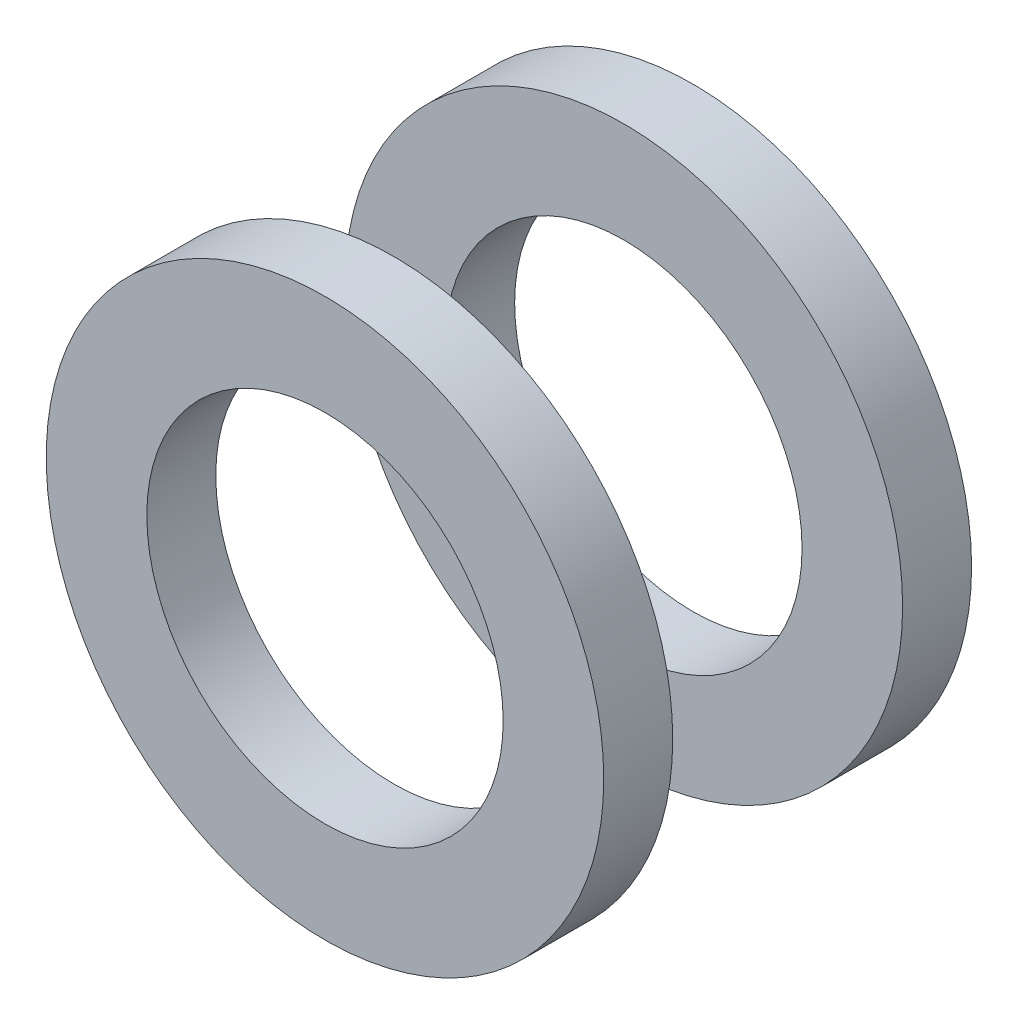
ISO-10303-21;
HEADER;
FILE_DESCRIPTION(('STEP AP214'),'2;1');
FILE_NAME('part.step','',(''),(''),'','','');
FILE_SCHEMA(('AUTOMOTIVE_DESIGN { 1 0 10303 214 1 1 1 1 }'));
ENDSEC;
DATA;
#1=APPLICATION_CONTEXT('core data for automotive mechanical design processes');
#2=APPLICATION_PROTOCOL_DEFINITION('international standard','automotive_design',2000,#1);
#3=PRODUCT_CONTEXT('',#1,'mechanical');
#4=PRODUCT('Part','Part','',(#3));
#5=PRODUCT_RELATED_PRODUCT_CATEGORY('part','',(#4));
#6=PRODUCT_DEFINITION_FORMATION('','',#4);
#7=PRODUCT_DEFINITION_CONTEXT('part definition',#1,'design');
#8=PRODUCT_DEFINITION('design','',#6,#7);
#9=PRODUCT_DEFINITION_SHAPE('','',#8);
#10=(LENGTH_UNIT() NAMED_UNIT(*) SI_UNIT(.MILLI.,.METRE.));
#11=(NAMED_UNIT(*) PLANE_ANGLE_UNIT() SI_UNIT($,.RADIAN.));
#12=(NAMED_UNIT(*) SI_UNIT($,.STERADIAN.) SOLID_ANGLE_UNIT());
#13=UNCERTAINTY_MEASURE_WITH_UNIT(LENGTH_MEASURE(1.E-05),#10,'distance_accuracy_value','');
#14=(GEOMETRIC_REPRESENTATION_CONTEXT(3) GLOBAL_UNCERTAINTY_ASSIGNED_CONTEXT((#13)) GLOBAL_UNIT_ASSIGNED_CONTEXT((#10,
#11,#12)) REPRESENTATION_CONTEXT('',''));
#15=CARTESIAN_POINT('',(0.,0.,0.));
#16=DIRECTION('',(0.,0.,1.));
#17=DIRECTION('',(1.,0.,0.));
#18=AXIS2_PLACEMENT_3D('',#15,#16,#17);
#19=CARTESIAN_POINT('',(0.,0.,32.));
#20=DIRECTION('',(0.,0.,1.));
#21=DIRECTION('',(1.,0.,0.));
#22=AXIS2_PLACEMENT_3D('',#19,#20,#21);
#23=PLANE('',#22);
#24=CARTESIAN_POINT('',(0.,0.,32.));
#25=DIRECTION('',(0.,0.,1.));
#26=DIRECTION('',(1.,0.,0.));
#27=AXIS2_PLACEMENT_3D('',#24,#25,#26);
#28=CIRCLE('',#27,48.5);
#29=CARTESIAN_POINT('',(48.5,0.,32.));
#30=VERTEX_POINT('',#29);
#31=EDGE_CURVE('E11',#30,#30,#28,.T.);
#32=ORIENTED_EDGE('',*,*,#31,.T.);
#33=EDGE_LOOP('',(#32));
#34=FACE_BOUND('',#33,.T.);
#35=CARTESIAN_POINT('',(0.,0.,32.));
#36=DIRECTION('',(0.,0.,1.));
#37=DIRECTION('',(1.,0.,0.));
#38=AXIS2_PLACEMENT_3D('',#35,#36,#37);
#39=CIRCLE('',#38,31.);
#40=CARTESIAN_POINT('',(31.,0.,32.));
#41=VERTEX_POINT('',#40);
#42=EDGE_CURVE('E58',#41,#41,#39,.T.);
#43=ORIENTED_EDGE('',*,*,#42,.F.);
#44=EDGE_LOOP('',(#43));
#45=FACE_BOUND('',#44,.T.);
#46=ADVANCED_FACE('F44',(#34,#45),#23,.T.);
#47=CARTESIAN_POINT('',(0.,0.,20.));
#48=DIRECTION('',(0.,0.,1.));
#49=DIRECTION('',(1.,0.,0.));
#50=AXIS2_PLACEMENT_3D('',#47,#48,#49);
#51=PLANE('',#50);
#52=CARTESIAN_POINT('',(0.,0.,20.));
#53=DIRECTION('',(0.,0.,1.));
#54=DIRECTION('',(1.,0.,0.));
#55=AXIS2_PLACEMENT_3D('',#52,#53,#54);
#56=CIRCLE('',#55,48.5);
#57=CARTESIAN_POINT('',(48.5,0.,20.));
#58=VERTEX_POINT('',#57);
#59=EDGE_CURVE('E48',#58,#58,#56,.T.);
#60=ORIENTED_EDGE('',*,*,#59,.F.);
#61=EDGE_LOOP('',(#60));
#62=FACE_BOUND('',#61,.T.);
#63=CARTESIAN_POINT('',(0.,0.,20.));
#64=DIRECTION('',(0.,0.,1.));
#65=DIRECTION('',(1.,0.,0.));
#66=AXIS2_PLACEMENT_3D('',#63,#64,#65);
#67=CIRCLE('',#66,31.);
#68=CARTESIAN_POINT('',(31.,0.,20.));
#69=VERTEX_POINT('',#68);
#70=EDGE_CURVE('E60',#69,#69,#67,.T.);
#71=ORIENTED_EDGE('',*,*,#70,.T.);
#72=EDGE_LOOP('',(#71));
#73=FACE_BOUND('',#72,.T.);
#74=ADVANCED_FACE('F71',(#62,#73),#51,.F.);
#75=CARTESIAN_POINT('',(0.,0.,32.));
#76=DIRECTION('',(0.,0.,-1.));
#77=DIRECTION('',(-1.,0.,0.));
#78=AXIS2_PLACEMENT_3D('',#75,#76,#77);
#79=CYLINDRICAL_SURFACE('',#78,48.5);
#80=ORIENTED_EDGE('',*,*,#31,.F.);
#81=EDGE_LOOP('',(#80));
#82=FACE_BOUND('',#81,.T.);
#83=ORIENTED_EDGE('',*,*,#59,.T.);
#84=EDGE_LOOP('',(#83));
#85=FACE_BOUND('',#84,.T.);
#86=ADVANCED_FACE('F46',(#82,#85),#79,.T.);
#87=CARTESIAN_POINT('',(0.,0.,32.));
#88=DIRECTION('',(0.,0.,-1.));
#89=DIRECTION('',(-1.,0.,0.));
#90=AXIS2_PLACEMENT_3D('',#87,#88,#89);
#91=CYLINDRICAL_SURFACE('',#90,31.);
#92=ORIENTED_EDGE('',*,*,#42,.T.);
#93=EDGE_LOOP('',(#92));
#94=FACE_BOUND('',#93,.T.);
#95=ORIENTED_EDGE('',*,*,#70,.F.);
#96=EDGE_LOOP('',(#95));
#97=FACE_BOUND('',#96,.T.);
#98=ADVANCED_FACE('F67',(#94,#97),#91,.F.);
#99=CLOSED_SHELL('',(#46,#74,#86,#98));
#100=MANIFOLD_SOLID_BREP('B2',#99);
#101=CARTESIAN_POINT('',(0.,0.,-20.));
#102=DIRECTION('',(0.,0.,1.));
#103=DIRECTION('',(1.,0.,0.));
#104=AXIS2_PLACEMENT_3D('',#101,#102,#103);
#105=PLANE('',#104);
#106=CARTESIAN_POINT('',(0.,0.,-20.));
#107=DIRECTION('',(0.,0.,1.));
#108=DIRECTION('',(1.,0.,0.));
#109=AXIS2_PLACEMENT_3D('',#106,#107,#108);
#110=CIRCLE('',#109,48.5);
#111=CARTESIAN_POINT('',(48.5,0.,-20.));
#112=VERTEX_POINT('',#111);
#113=EDGE_CURVE('E43',#112,#112,#110,.T.);
#114=ORIENTED_EDGE('',*,*,#113,.T.);
#115=EDGE_LOOP('',(#114));
#116=FACE_BOUND('',#115,.T.);
#117=CARTESIAN_POINT('',(0.,0.,-20.));
#118=DIRECTION('',(0.,0.,1.));
#119=DIRECTION('',(1.,0.,0.));
#120=AXIS2_PLACEMENT_3D('',#117,#118,#119);
#121=CIRCLE('',#120,31.);
#122=CARTESIAN_POINT('',(31.,0.,-20.));
#123=VERTEX_POINT('',#122);
#124=EDGE_CURVE('E126',#123,#123,#121,.T.);
#125=ORIENTED_EDGE('',*,*,#124,.F.);
#126=EDGE_LOOP('',(#125));
#127=FACE_BOUND('',#126,.T.);
#128=ADVANCED_FACE('F113',(#116,#127),#105,.T.);
#129=CARTESIAN_POINT('',(0.,0.,-32.));
#130=DIRECTION('',(0.,0.,1.));
#131=DIRECTION('',(1.,0.,0.));
#132=AXIS2_PLACEMENT_3D('',#129,#130,#131);
#133=PLANE('',#132);
#134=CARTESIAN_POINT('',(0.,0.,-32.));
#135=DIRECTION('',(0.,0.,1.));
#136=DIRECTION('',(1.,0.,0.));
#137=AXIS2_PLACEMENT_3D('',#134,#135,#136);
#138=CIRCLE('',#137,48.5);
#139=CARTESIAN_POINT('',(48.5,0.,-32.));
#140=VERTEX_POINT('',#139);
#141=EDGE_CURVE('E117',#140,#140,#138,.T.);
#142=ORIENTED_EDGE('',*,*,#141,.F.);
#143=EDGE_LOOP('',(#142));
#144=FACE_BOUND('',#143,.T.);
#145=CARTESIAN_POINT('',(0.,0.,-32.));
#146=DIRECTION('',(0.,0.,1.));
#147=DIRECTION('',(1.,0.,0.));
#148=AXIS2_PLACEMENT_3D('',#145,#146,#147);
#149=CIRCLE('',#148,31.);
#150=CARTESIAN_POINT('',(31.,0.,-32.));
#151=VERTEX_POINT('',#150);
#152=EDGE_CURVE('E128',#151,#151,#149,.T.);
#153=ORIENTED_EDGE('',*,*,#152,.T.);
#154=EDGE_LOOP('',(#153));
#155=FACE_BOUND('',#154,.T.);
#156=ADVANCED_FACE('F140',(#144,#155),#133,.F.);
#157=CARTESIAN_POINT('',(0.,0.,-20.));
#158=DIRECTION('',(0.,0.,-1.));
#159=DIRECTION('',(-1.,0.,0.));
#160=AXIS2_PLACEMENT_3D('',#157,#158,#159);
#161=CYLINDRICAL_SURFACE('',#160,48.5);
#162=ORIENTED_EDGE('',*,*,#113,.F.);
#163=EDGE_LOOP('',(#162));
#164=FACE_BOUND('',#163,.T.);
#165=ORIENTED_EDGE('',*,*,#141,.T.);
#166=EDGE_LOOP('',(#165));
#167=FACE_BOUND('',#166,.T.);
#168=ADVANCED_FACE('F115',(#164,#167),#161,.T.);
#169=CARTESIAN_POINT('',(0.,0.,-20.));
#170=DIRECTION('',(0.,0.,-1.));
#171=DIRECTION('',(-1.,0.,0.));
#172=AXIS2_PLACEMENT_3D('',#169,#170,#171);
#173=CYLINDRICAL_SURFACE('',#172,31.);
#174=ORIENTED_EDGE('',*,*,#124,.T.);
#175=EDGE_LOOP('',(#174));
#176=FACE_BOUND('',#175,.T.);
#177=ORIENTED_EDGE('',*,*,#152,.F.);
#178=EDGE_LOOP('',(#177));
#179=FACE_BOUND('',#178,.T.);
#180=ADVANCED_FACE('F136',(#176,#179),#173,.F.);
#181=CLOSED_SHELL('',(#128,#156,#168,#180));
#182=MANIFOLD_SOLID_BREP('B6',#181);
#183=ADVANCED_BREP_SHAPE_REPRESENTATION('',(#18,#100,#182),#14);
#184=SHAPE_DEFINITION_REPRESENTATION(#9,#183);
ENDSEC;
END-ISO-10303-21;
